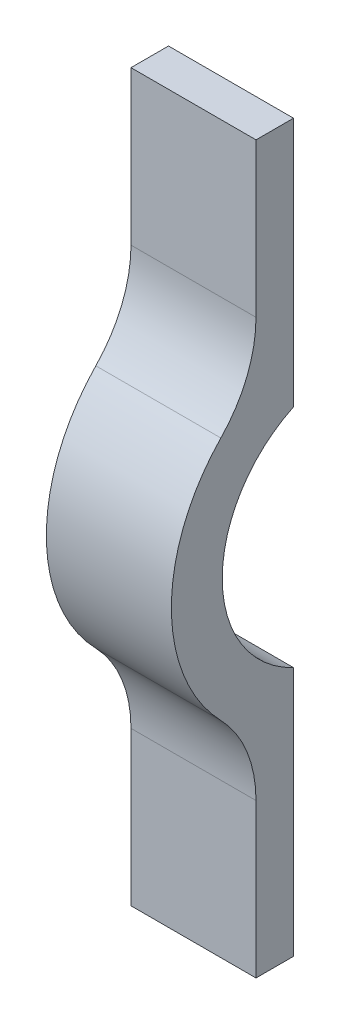
ISO-10303-21;
HEADER;
FILE_DESCRIPTION(('STEP AP214'),'2;1');
FILE_NAME('part.step','',(''),(''),'','','');
FILE_SCHEMA(('AUTOMOTIVE_DESIGN { 1 0 10303 214 1 1 1 1 }'));
ENDSEC;
DATA;
#1=APPLICATION_CONTEXT('core data for automotive mechanical design processes');
#2=APPLICATION_PROTOCOL_DEFINITION('international standard','automotive_design',2000,#1);
#3=PRODUCT_CONTEXT('',#1,'mechanical');
#4=PRODUCT('Part','Part','',(#3));
#5=PRODUCT_RELATED_PRODUCT_CATEGORY('part','',(#4));
#6=PRODUCT_DEFINITION_FORMATION('','',#4);
#7=PRODUCT_DEFINITION_CONTEXT('part definition',#1,'design');
#8=PRODUCT_DEFINITION('design','',#6,#7);
#9=PRODUCT_DEFINITION_SHAPE('','',#8);
#10=(LENGTH_UNIT() NAMED_UNIT(*) SI_UNIT(.MILLI.,.METRE.));
#11=(NAMED_UNIT(*) PLANE_ANGLE_UNIT() SI_UNIT($,.RADIAN.));
#12=(NAMED_UNIT(*) SI_UNIT($,.STERADIAN.) SOLID_ANGLE_UNIT());
#13=UNCERTAINTY_MEASURE_WITH_UNIT(LENGTH_MEASURE(1.E-05),#10,'distance_accuracy_value','');
#14=(GEOMETRIC_REPRESENTATION_CONTEXT(3) GLOBAL_UNCERTAINTY_ASSIGNED_CONTEXT((#13)) GLOBAL_UNIT_ASSIGNED_CONTEXT((#10,
#11,#12)) REPRESENTATION_CONTEXT('',''));
#15=CARTESIAN_POINT('',(0.,0.,0.));
#16=DIRECTION('',(0.,0.,1.));
#17=DIRECTION('',(1.,0.,0.));
#18=AXIS2_PLACEMENT_3D('',#15,#16,#17);
#19=CARTESIAN_POINT('',(10.,0.,0.));
#20=DIRECTION('',(-1.,0.,0.));
#21=DIRECTION('',(0.,0.,1.));
#22=AXIS2_PLACEMENT_3D('',#19,#20,#21);
#23=CYLINDRICAL_SURFACE('',#22,10.);
#24=CARTESIAN_POINT('',(0.,0.,0.));
#25=DIRECTION('',(-1.,0.,0.));
#26=DIRECTION('',(0.,0.,1.));
#27=AXIS2_PLACEMENT_3D('',#24,#25,#26);
#28=CIRCLE('',#27,10.);
#29=CARTESIAN_POINT('',(0.,-9.02828887442134,4.29999999999999));
#30=VERTEX_POINT('',#29);
#31=CARTESIAN_POINT('',(0.,9.02828887442133,4.3));
#32=VERTEX_POINT('',#31);
#33=EDGE_CURVE('E124',#30,#32,#28,.T.);
#34=ORIENTED_EDGE('',*,*,#33,.T.);
#35=DIRECTION('',(-1.,0.,0.));
#36=VECTOR('',#35,1.);
#37=CARTESIAN_POINT('',(10.,9.02828887442133,4.3));
#38=LINE('',#37,#36);
#39=CARTESIAN_POINT('',(10.,9.02828887442133,4.3));
#40=VERTEX_POINT('',#39);
#41=EDGE_CURVE('E180',#40,#32,#38,.T.);
#42=ORIENTED_EDGE('',*,*,#41,.F.);
#43=CARTESIAN_POINT('',(10.,0.,0.));
#44=DIRECTION('',(-1.,0.,0.));
#45=DIRECTION('',(0.,0.,1.));
#46=AXIS2_PLACEMENT_3D('',#43,#44,#45);
#47=CIRCLE('',#46,10.);
#48=CARTESIAN_POINT('',(10.,-9.02828887442134,4.29999999999999));
#49=VERTEX_POINT('',#48);
#50=EDGE_CURVE('E153',#49,#40,#47,.T.);
#51=ORIENTED_EDGE('',*,*,#50,.F.);
#52=DIRECTION('',(-1.,0.,0.));
#53=VECTOR('',#52,1.);
#54=CARTESIAN_POINT('',(10.,-9.02828887442134,4.29999999999999));
#55=LINE('',#54,#53);
#56=EDGE_CURVE('E142',#49,#30,#55,.T.);
#57=ORIENTED_EDGE('',*,*,#56,.T.);
#58=EDGE_LOOP('',(#34,#42,#51,#57));
#59=FACE_BOUND('',#58,.T.);
#60=ADVANCED_FACE('F35',(#59),#23,.F.);
#61=CARTESIAN_POINT('',(10.,9.02828887442133,4.3));
#62=DIRECTION('',(0.,0.,1.));
#63=DIRECTION('',(1.,0.,0.));
#64=AXIS2_PLACEMENT_3D('',#61,#62,#63);
#65=PLANE('',#64);
#66=DIRECTION('',(0.,1.,0.));
#67=VECTOR('',#66,1.);
#68=CARTESIAN_POINT('',(0.,9.02828887442133,4.3));
#69=LINE('',#68,#67);
#70=CARTESIAN_POINT('',(0.,29.0282888744213,4.3));
#71=VERTEX_POINT('',#70);
#72=EDGE_CURVE('E167',#32,#71,#69,.T.);
#73=ORIENTED_EDGE('',*,*,#72,.T.);
#74=DIRECTION('',(-1.,0.,0.));
#75=VECTOR('',#74,1.);
#76=CARTESIAN_POINT('',(10.,29.0282888744213,4.3));
#77=LINE('',#76,#75);
#78=CARTESIAN_POINT('',(10.,29.0282888744213,4.3));
#79=VERTEX_POINT('',#78);
#80=EDGE_CURVE('E177',#79,#71,#77,.T.);
#81=ORIENTED_EDGE('',*,*,#80,.F.);
#82=DIRECTION('',(0.,1.,0.));
#83=VECTOR('',#82,1.);
#84=CARTESIAN_POINT('',(10.,9.02828887442133,4.3));
#85=LINE('',#84,#83);
#86=EDGE_CURVE('E155',#40,#79,#85,.T.);
#87=ORIENTED_EDGE('',*,*,#86,.F.);
#88=ORIENTED_EDGE('',*,*,#41,.T.);
#89=EDGE_LOOP('',(#73,#81,#87,#88));
#90=FACE_BOUND('',#89,.T.);
#91=ADVANCED_FACE('F212',(#90),#65,.F.);
#92=CARTESIAN_POINT('',(10.,29.0282888744213,4.3));
#93=DIRECTION('',(0.,-1.,0.));
#94=DIRECTION('',(0.,0.,-1.));
#95=AXIS2_PLACEMENT_3D('',#92,#93,#94);
#96=PLANE('',#95);
#97=DIRECTION('',(0.,0.,1.));
#98=VECTOR('',#97,1.);
#99=CARTESIAN_POINT('',(0.,29.0282888744213,4.3));
#100=LINE('',#99,#98);
#101=CARTESIAN_POINT('',(0.,29.0282888744213,7.3));
#102=VERTEX_POINT('',#101);
#103=EDGE_CURVE('E169',#71,#102,#100,.T.);
#104=ORIENTED_EDGE('',*,*,#103,.T.);
#105=DIRECTION('',(-1.,0.,0.));
#106=VECTOR('',#105,1.);
#107=CARTESIAN_POINT('',(10.,29.0282888744213,7.3));
#108=LINE('',#107,#106);
#109=CARTESIAN_POINT('',(10.,29.0282888744213,7.3));
#110=VERTEX_POINT('',#109);
#111=EDGE_CURVE('E164',#110,#102,#108,.T.);
#112=ORIENTED_EDGE('',*,*,#111,.F.);
#113=DIRECTION('',(0.,0.,1.));
#114=VECTOR('',#113,1.);
#115=CARTESIAN_POINT('',(10.,29.0282888744213,4.3));
#116=LINE('',#115,#114);
#117=EDGE_CURVE('E158',#79,#110,#116,.T.);
#118=ORIENTED_EDGE('',*,*,#117,.F.);
#119=ORIENTED_EDGE('',*,*,#80,.T.);
#120=EDGE_LOOP('',(#104,#112,#118,#119));
#121=FACE_BOUND('',#120,.T.);
#122=ADVANCED_FACE('F217',(#121),#96,.F.);
#123=CARTESIAN_POINT('',(10.,29.0282888744213,7.3));
#124=DIRECTION('',(0.,0.,-1.));
#125=DIRECTION('',(0.,1.,0.));
#126=AXIS2_PLACEMENT_3D('',#123,#124,#125);
#127=PLANE('',#126);
#128=DIRECTION('',(0.,-1.,0.));
#129=VECTOR('',#128,1.);
#130=CARTESIAN_POINT('',(0.,29.0282888744213,7.3));
#131=LINE('',#130,#129);
#132=CARTESIAN_POINT('',(0.,16.7356854765138,7.3));
#133=VERTEX_POINT('',#132);
#134=EDGE_CURVE('E171',#102,#133,#131,.T.);
#135=ORIENTED_EDGE('',*,*,#134,.T.);
#136=DIRECTION('',(1.,0.,0.));
#137=VECTOR('',#136,1.);
#138=CARTESIAN_POINT('',(10.,16.7356854765138,7.3));
#139=LINE('',#138,#137);
#140=CARTESIAN_POINT('',(10.,16.7356854765138,7.3));
#141=VERTEX_POINT('',#140);
#142=EDGE_CURVE('E50',#133,#141,#139,.T.);
#143=ORIENTED_EDGE('',*,*,#142,.T.);
#144=DIRECTION('',(0.,-1.,0.));
#145=VECTOR('',#144,1.);
#146=CARTESIAN_POINT('',(10.,29.0282888744213,7.3));
#147=LINE('',#146,#145);
#148=EDGE_CURVE('E160',#110,#141,#147,.T.);
#149=ORIENTED_EDGE('',*,*,#148,.F.);
#150=ORIENTED_EDGE('',*,*,#111,.T.);
#151=EDGE_LOOP('',(#135,#143,#149,#150));
#152=FACE_BOUND('',#151,.T.);
#153=ADVANCED_FACE('F223',(#152),#127,.F.);
#154=CARTESIAN_POINT('',(10.,0.,0.));
#155=DIRECTION('',(-1.,0.,0.));
#156=DIRECTION('',(0.,0.,1.));
#157=AXIS2_PLACEMENT_3D('',#154,#155,#156);
#158=CYLINDRICAL_SURFACE('',#157,14.0701717561133);
#159=CARTESIAN_POINT('',(0.,0.,0.));
#160=DIRECTION('',(1.,0.,0.));
#161=DIRECTION('',(0.,0.,-1.));
#162=AXIS2_PLACEMENT_3D('',#159,#160,#161);
#163=CIRCLE('',#162,14.0701717561133);
#164=CARTESIAN_POINT('',(0.,9.78281216672391,10.1126811161594));
#165=VERTEX_POINT('',#164);
#166=CARTESIAN_POINT('',(0.,-9.78281216672392,10.1126811161594));
#167=VERTEX_POINT('',#166);
#168=EDGE_CURVE('E156',#165,#167,#163,.T.);
#169=ORIENTED_EDGE('',*,*,#168,.T.);
#170=DIRECTION('',(-1.,0.,0.));
#171=VECTOR('',#170,1.);
#172=CARTESIAN_POINT('',(10.,-9.78281216672392,10.1126811161594));
#173=LINE('',#172,#171);
#174=CARTESIAN_POINT('',(10.,-9.78281216672392,10.1126811161594));
#175=VERTEX_POINT('',#174);
#176=EDGE_CURVE('E188',#167,#175,#173,.F.);
#177=ORIENTED_EDGE('',*,*,#176,.T.);
#178=CARTESIAN_POINT('',(10.,0.,0.));
#179=DIRECTION('',(1.,0.,0.));
#180=DIRECTION('',(0.,0.,-1.));
#181=AXIS2_PLACEMENT_3D('',#178,#179,#180);
#182=CIRCLE('',#181,14.0701717561133);
#183=CARTESIAN_POINT('',(10.,9.78281216672391,10.1126811161594));
#184=VERTEX_POINT('',#183);
#185=EDGE_CURVE('E162',#184,#175,#182,.T.);
#186=ORIENTED_EDGE('',*,*,#185,.F.);
#187=DIRECTION('',(-1.,0.,0.));
#188=VECTOR('',#187,1.);
#189=CARTESIAN_POINT('',(10.,9.78281216672391,10.1126811161594));
#190=LINE('',#189,#188);
#191=EDGE_CURVE('E185',#184,#165,#190,.T.);
#192=ORIENTED_EDGE('',*,*,#191,.T.);
#193=EDGE_LOOP('',(#169,#177,#186,#192));
#194=FACE_BOUND('',#193,.T.);
#195=ADVANCED_FACE('F197',(#194),#158,.T.);
#196=CARTESIAN_POINT('',(10.,0.,0.));
#197=DIRECTION('',(-1.,0.,0.));
#198=DIRECTION('',(0.,0.,1.));
#199=AXIS2_PLACEMENT_3D('',#196,#197,#198);
#200=PLANE('',#199);
#201=ORIENTED_EDGE('',*,*,#50,.T.);
#202=ORIENTED_EDGE('',*,*,#86,.T.);
#203=ORIENTED_EDGE('',*,*,#117,.T.);
#204=ORIENTED_EDGE('',*,*,#148,.T.);
#205=CARTESIAN_POINT('',(10.,16.7356854765138,17.3));
#206=DIRECTION('',(-1.,0.,0.));
#207=DIRECTION('',(0.,0.,1.));
#208=AXIS2_PLACEMENT_3D('',#205,#206,#207);
#209=CIRCLE('',#208,10.);
#210=EDGE_CURVE('E11',#141,#184,#209,.T.);
#211=ORIENTED_EDGE('',*,*,#210,.T.);
#212=ORIENTED_EDGE('',*,*,#185,.T.);
#213=CARTESIAN_POINT('',(10.,-16.7356854765138,17.3));
#214=DIRECTION('',(-1.,0.,0.));
#215=DIRECTION('',(0.,0.,1.));
#216=AXIS2_PLACEMENT_3D('',#213,#214,#215);
#217=CIRCLE('',#216,10.);
#218=CARTESIAN_POINT('',(10.,-16.7356854765138,7.29999999999999));
#219=VERTEX_POINT('',#218);
#220=EDGE_CURVE('E136',#175,#219,#217,.T.);
#221=ORIENTED_EDGE('',*,*,#220,.T.);
#222=DIRECTION('',(0.,1.,0.));
#223=VECTOR('',#222,1.);
#224=CARTESIAN_POINT('',(10.,-29.0282888744213,7.29999999999998));
#225=LINE('',#224,#223);
#226=CARTESIAN_POINT('',(10.,-29.0282888744213,7.29999999999998));
#227=VERTEX_POINT('',#226);
#228=EDGE_CURVE('E116',#227,#219,#225,.T.);
#229=ORIENTED_EDGE('',*,*,#228,.F.);
#230=DIRECTION('',(0.,0.,1.));
#231=VECTOR('',#230,1.);
#232=CARTESIAN_POINT('',(10.,-29.0282888744213,4.29999999999998));
#233=LINE('',#232,#231);
#234=CARTESIAN_POINT('',(10.,-29.0282888744213,4.29999999999998));
#235=VERTEX_POINT('',#234);
#236=EDGE_CURVE('E132',#235,#227,#233,.T.);
#237=ORIENTED_EDGE('',*,*,#236,.F.);
#238=DIRECTION('',(0.,-1.,0.));
#239=VECTOR('',#238,1.);
#240=CARTESIAN_POINT('',(10.,-9.02828887442134,4.29999999999999));
#241=LINE('',#240,#239);
#242=EDGE_CURVE('E140',#49,#235,#241,.T.);
#243=ORIENTED_EDGE('',*,*,#242,.F.);
#244=EDGE_LOOP('',(#201,#202,#203,#204,#211,#212,#221,#229,#237,#243));
#245=FACE_BOUND('',#244,.T.);
#246=ADVANCED_FACE('F130',(#245),#200,.F.);
#247=CARTESIAN_POINT('',(0.,0.,0.));
#248=DIRECTION('',(-1.,0.,0.));
#249=DIRECTION('',(0.,0.,1.));
#250=AXIS2_PLACEMENT_3D('',#247,#248,#249);
#251=PLANE('',#250);
#252=ORIENTED_EDGE('',*,*,#33,.F.);
#253=DIRECTION('',(0.,-1.,0.));
#254=VECTOR('',#253,1.);
#255=CARTESIAN_POINT('',(0.,-9.02828887442134,4.29999999999999));
#256=LINE('',#255,#254);
#257=CARTESIAN_POINT('',(0.,-29.0282888744213,4.29999999999998));
#258=VERTEX_POINT('',#257);
#259=EDGE_CURVE('E137',#30,#258,#256,.T.);
#260=ORIENTED_EDGE('',*,*,#259,.T.);
#261=DIRECTION('',(0.,0.,1.));
#262=VECTOR('',#261,1.);
#263=CARTESIAN_POINT('',(0.,-29.0282888744213,4.29999999999998));
#264=LINE('',#263,#262);
#265=CARTESIAN_POINT('',(0.,-29.0282888744213,7.29999999999998));
#266=VERTEX_POINT('',#265);
#267=EDGE_CURVE('E146',#258,#266,#264,.T.);
#268=ORIENTED_EDGE('',*,*,#267,.T.);
#269=DIRECTION('',(0.,1.,0.));
#270=VECTOR('',#269,1.);
#271=CARTESIAN_POINT('',(0.,-29.0282888744213,7.29999999999998));
#272=LINE('',#271,#270);
#273=CARTESIAN_POINT('',(0.,-16.7356854765138,7.29999999999999));
#274=VERTEX_POINT('',#273);
#275=EDGE_CURVE('E119',#266,#274,#272,.T.);
#276=ORIENTED_EDGE('',*,*,#275,.T.);
#277=CARTESIAN_POINT('',(0.,-16.7356854765138,17.3));
#278=DIRECTION('',(-1.,0.,0.));
#279=DIRECTION('',(0.,0.,1.));
#280=AXIS2_PLACEMENT_3D('',#277,#278,#279);
#281=CIRCLE('',#280,10.);
#282=EDGE_CURVE('E191',#274,#167,#281,.F.);
#283=ORIENTED_EDGE('',*,*,#282,.T.);
#284=ORIENTED_EDGE('',*,*,#168,.F.);
#285=CARTESIAN_POINT('',(0.,16.7356854765138,17.3));
#286=DIRECTION('',(-1.,0.,0.));
#287=DIRECTION('',(0.,0.,1.));
#288=AXIS2_PLACEMENT_3D('',#285,#286,#287);
#289=CIRCLE('',#288,10.);
#290=EDGE_CURVE('E43',#165,#133,#289,.F.);
#291=ORIENTED_EDGE('',*,*,#290,.T.);
#292=ORIENTED_EDGE('',*,*,#134,.F.);
#293=ORIENTED_EDGE('',*,*,#103,.F.);
#294=ORIENTED_EDGE('',*,*,#72,.F.);
#295=EDGE_LOOP('',(#252,#260,#268,#276,#283,#284,#291,#292,#293,#294));
#296=FACE_BOUND('',#295,.T.);
#297=ADVANCED_FACE('F193',(#296),#251,.T.);
#298=CARTESIAN_POINT('',(10.,-29.0282888744213,7.29999999999998));
#299=DIRECTION('',(0.,0.,1.));
#300=DIRECTION('',(0.,-1.,0.));
#301=AXIS2_PLACEMENT_3D('',#298,#299,#300);
#302=PLANE('',#301);
#303=ORIENTED_EDGE('',*,*,#228,.T.);
#304=DIRECTION('',(-1.,0.,0.));
#305=VECTOR('',#304,1.);
#306=CARTESIAN_POINT('',(10.,-16.7356854765138,7.29999999999999));
#307=LINE('',#306,#305);
#308=EDGE_CURVE('E183',#219,#274,#307,.T.);
#309=ORIENTED_EDGE('',*,*,#308,.T.);
#310=ORIENTED_EDGE('',*,*,#275,.F.);
#311=DIRECTION('',(-1.,0.,0.));
#312=VECTOR('',#311,1.);
#313=CARTESIAN_POINT('',(10.,-29.0282888744213,7.29999999999998));
#314=LINE('',#313,#312);
#315=EDGE_CURVE('E112',#227,#266,#314,.T.);
#316=ORIENTED_EDGE('',*,*,#315,.F.);
#317=EDGE_LOOP('',(#303,#309,#310,#316));
#318=FACE_BOUND('',#317,.T.);
#319=ADVANCED_FACE('F114',(#318),#302,.T.);
#320=CARTESIAN_POINT('',(10.,-29.0282888744213,4.29999999999998));
#321=DIRECTION('',(0.,-1.,0.));
#322=DIRECTION('',(0.,0.,-1.));
#323=AXIS2_PLACEMENT_3D('',#320,#321,#322);
#324=PLANE('',#323);
#325=ORIENTED_EDGE('',*,*,#267,.F.);
#326=DIRECTION('',(-1.,0.,0.));
#327=VECTOR('',#326,1.);
#328=CARTESIAN_POINT('',(10.,-29.0282888744213,4.29999999999998));
#329=LINE('',#328,#327);
#330=EDGE_CURVE('E125',#235,#258,#329,.T.);
#331=ORIENTED_EDGE('',*,*,#330,.F.);
#332=ORIENTED_EDGE('',*,*,#236,.T.);
#333=ORIENTED_EDGE('',*,*,#315,.T.);
#334=EDGE_LOOP('',(#325,#331,#332,#333));
#335=FACE_BOUND('',#334,.T.);
#336=ADVANCED_FACE('F139',(#335),#324,.T.);
#337=CARTESIAN_POINT('',(10.,-9.02828887442134,4.29999999999999));
#338=DIRECTION('',(0.,0.,-1.));
#339=DIRECTION('',(0.,1.,0.));
#340=AXIS2_PLACEMENT_3D('',#337,#338,#339);
#341=PLANE('',#340);
#342=ORIENTED_EDGE('',*,*,#259,.F.);
#343=ORIENTED_EDGE('',*,*,#56,.F.);
#344=ORIENTED_EDGE('',*,*,#242,.T.);
#345=ORIENTED_EDGE('',*,*,#330,.T.);
#346=EDGE_LOOP('',(#342,#343,#344,#345));
#347=FACE_BOUND('',#346,.T.);
#348=ADVANCED_FACE('F202',(#347),#341,.T.);
#349=CARTESIAN_POINT('',(10.,-16.7356854765138,17.3));
#350=DIRECTION('',(-1.,0.,0.));
#351=DIRECTION('',(0.,0.,1.));
#352=AXIS2_PLACEMENT_3D('',#349,#350,#351);
#353=CYLINDRICAL_SURFACE('',#352,10.);
#354=ORIENTED_EDGE('',*,*,#220,.F.);
#355=ORIENTED_EDGE('',*,*,#176,.F.);
#356=ORIENTED_EDGE('',*,*,#282,.F.);
#357=ORIENTED_EDGE('',*,*,#308,.F.);
#358=EDGE_LOOP('',(#354,#355,#356,#357));
#359=FACE_BOUND('',#358,.T.);
#360=ADVANCED_FACE('F200',(#359),#353,.F.);
#361=CARTESIAN_POINT('',(10.,16.7356854765138,17.3));
#362=DIRECTION('',(-1.,0.,0.));
#363=DIRECTION('',(0.,0.,1.));
#364=AXIS2_PLACEMENT_3D('',#361,#362,#363);
#365=CYLINDRICAL_SURFACE('',#364,10.);
#366=ORIENTED_EDGE('',*,*,#210,.F.);
#367=ORIENTED_EDGE('',*,*,#142,.F.);
#368=ORIENTED_EDGE('',*,*,#290,.F.);
#369=ORIENTED_EDGE('',*,*,#191,.F.);
#370=EDGE_LOOP('',(#366,#367,#368,#369));
#371=FACE_BOUND('',#370,.T.);
#372=ADVANCED_FACE('F37',(#371),#365,.F.);
#373=CLOSED_SHELL('',(#60,#91,#122,#153,#195,#246,#297,#319,#336,#348,#360,#372));
#374=MANIFOLD_SOLID_BREP('B2',#373);
#375=ADVANCED_BREP_SHAPE_REPRESENTATION('',(#18,#374),#14);
#376=SHAPE_DEFINITION_REPRESENTATION(#9,#375);
ENDSEC;
END-ISO-10303-21;
